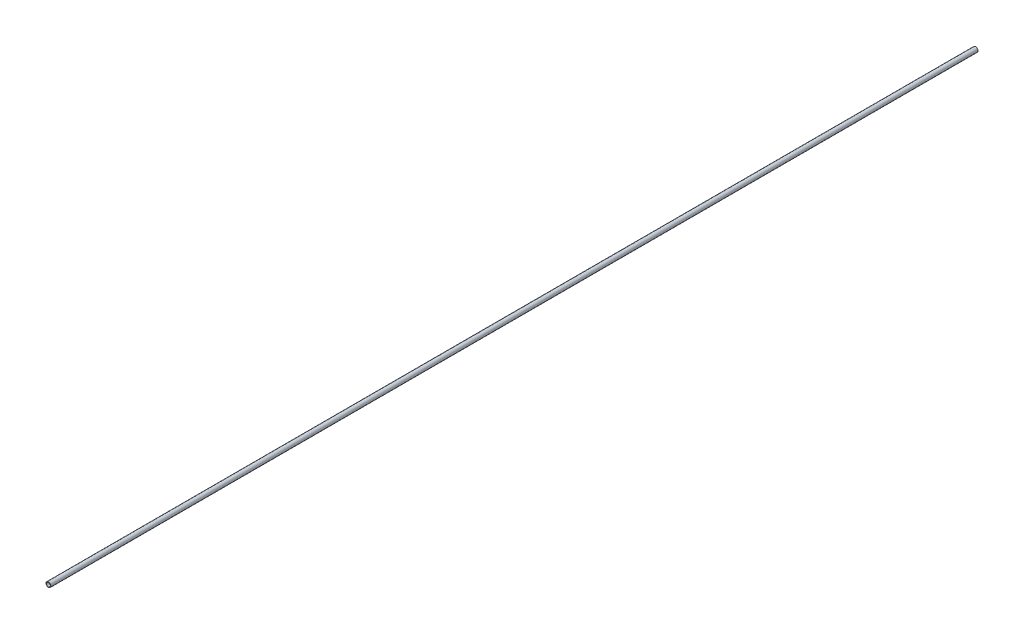
ISO-10303-21;
HEADER;
FILE_DESCRIPTION(('STEP AP214'),'2;1');
FILE_NAME('part.step','',(''),(''),'','','');
FILE_SCHEMA(('AUTOMOTIVE_DESIGN { 1 0 10303 214 1 1 1 1 }'));
ENDSEC;
DATA;
#1=APPLICATION_CONTEXT('core data for automotive mechanical design processes');
#2=APPLICATION_PROTOCOL_DEFINITION('international standard','automotive_design',2000,#1);
#3=PRODUCT_CONTEXT('',#1,'mechanical');
#4=PRODUCT('Part','Part','',(#3));
#5=PRODUCT_RELATED_PRODUCT_CATEGORY('part','',(#4));
#6=PRODUCT_DEFINITION_FORMATION('','',#4);
#7=PRODUCT_DEFINITION_CONTEXT('part definition',#1,'design');
#8=PRODUCT_DEFINITION('design','',#6,#7);
#9=PRODUCT_DEFINITION_SHAPE('','',#8);
#10=(LENGTH_UNIT() NAMED_UNIT(*) SI_UNIT(.MILLI.,.METRE.));
#11=(NAMED_UNIT(*) PLANE_ANGLE_UNIT() SI_UNIT($,.RADIAN.));
#12=(NAMED_UNIT(*) SI_UNIT($,.STERADIAN.) SOLID_ANGLE_UNIT());
#13=UNCERTAINTY_MEASURE_WITH_UNIT(LENGTH_MEASURE(1.E-05),#10,'distance_accuracy_value','');
#14=(GEOMETRIC_REPRESENTATION_CONTEXT(3) GLOBAL_UNCERTAINTY_ASSIGNED_CONTEXT((#13)) GLOBAL_UNIT_ASSIGNED_CONTEXT((#10,
#11,#12)) REPRESENTATION_CONTEXT('',''));
#15=CARTESIAN_POINT('',(0.,0.,0.));
#16=DIRECTION('',(0.,0.,1.));
#17=DIRECTION('',(1.,0.,0.));
#18=AXIS2_PLACEMENT_3D('',#15,#16,#17);
#19=CARTESIAN_POINT('',(0.,0.,-6426.2));
#20=DIRECTION('',(0.,0.,1.));
#21=DIRECTION('',(1.,0.,0.));
#22=AXIS2_PLACEMENT_3D('',#19,#20,#21);
#23=CYLINDRICAL_SURFACE('',#22,16.7005);
#24=CARTESIAN_POINT('',(0.,0.,-6426.2));
#25=DIRECTION('',(0.,0.,1.));
#26=DIRECTION('',(1.,0.,0.));
#27=AXIS2_PLACEMENT_3D('',#24,#25,#26);
#28=CIRCLE('',#27,16.7005);
#29=CARTESIAN_POINT('',(16.7005,0.,-6426.2));
#30=VERTEX_POINT('',#29);
#31=EDGE_CURVE('E10',#30,#30,#28,.T.);
#32=ORIENTED_EDGE('',*,*,#31,.T.);
#33=EDGE_LOOP('',(#32));
#34=FACE_BOUND('',#33,.T.);
#35=CARTESIAN_POINT('',(0.,0.,0.));
#36=DIRECTION('',(0.,0.,1.));
#37=DIRECTION('',(1.,0.,0.));
#38=AXIS2_PLACEMENT_3D('',#35,#36,#37);
#39=CIRCLE('',#38,16.7005);
#40=CARTESIAN_POINT('',(16.7005,0.,0.));
#41=VERTEX_POINT('',#40);
#42=EDGE_CURVE('E36',#41,#41,#39,.T.);
#43=ORIENTED_EDGE('',*,*,#42,.F.);
#44=EDGE_LOOP('',(#43));
#45=FACE_BOUND('',#44,.T.);
#46=ADVANCED_FACE('F33',(#34,#45),#23,.T.);
#47=CARTESIAN_POINT('',(0.,0.,-6426.2));
#48=DIRECTION('',(0.,0.,1.));
#49=DIRECTION('',(1.,0.,0.));
#50=AXIS2_PLACEMENT_3D('',#47,#48,#49);
#51=PLANE('',#50);
#52=CARTESIAN_POINT('',(0.,0.,-6426.2));
#53=DIRECTION('',(0.,0.,1.));
#54=DIRECTION('',(1.,0.,0.));
#55=AXIS2_PLACEMENT_3D('',#52,#53,#54);
#56=CIRCLE('',#55,13.3223);
#57=CARTESIAN_POINT('',(13.3223,0.,-6426.2));
#58=VERTEX_POINT('',#57);
#59=EDGE_CURVE('E43',#58,#58,#56,.T.);
#60=ORIENTED_EDGE('',*,*,#59,.T.);
#61=EDGE_LOOP('',(#60));
#62=FACE_BOUND('',#61,.T.);
#63=ORIENTED_EDGE('',*,*,#31,.F.);
#64=EDGE_LOOP('',(#63));
#65=FACE_BOUND('',#64,.T.);
#66=ADVANCED_FACE('F51',(#62,#65),#51,.F.);
#67=CARTESIAN_POINT('',(0.,0.,0.));
#68=DIRECTION('',(0.,0.,1.));
#69=DIRECTION('',(1.,0.,0.));
#70=AXIS2_PLACEMENT_3D('',#67,#68,#69);
#71=PLANE('',#70);
#72=CARTESIAN_POINT('',(0.,0.,0.));
#73=DIRECTION('',(0.,0.,1.));
#74=DIRECTION('',(1.,0.,0.));
#75=AXIS2_PLACEMENT_3D('',#72,#73,#74);
#76=CIRCLE('',#75,13.3223);
#77=CARTESIAN_POINT('',(13.3223,0.,0.));
#78=VERTEX_POINT('',#77);
#79=EDGE_CURVE('E45',#78,#78,#76,.T.);
#80=ORIENTED_EDGE('',*,*,#79,.F.);
#81=EDGE_LOOP('',(#80));
#82=FACE_BOUND('',#81,.T.);
#83=ORIENTED_EDGE('',*,*,#42,.T.);
#84=EDGE_LOOP('',(#83));
#85=FACE_BOUND('',#84,.T.);
#86=ADVANCED_FACE('F57',(#82,#85),#71,.T.);
#87=CARTESIAN_POINT('',(0.,0.,-6426.2));
#88=DIRECTION('',(0.,0.,1.));
#89=DIRECTION('',(1.,0.,0.));
#90=AXIS2_PLACEMENT_3D('',#87,#88,#89);
#91=CYLINDRICAL_SURFACE('',#90,13.3223);
#92=ORIENTED_EDGE('',*,*,#59,.F.);
#93=EDGE_LOOP('',(#92));
#94=FACE_BOUND('',#93,.T.);
#95=ORIENTED_EDGE('',*,*,#79,.T.);
#96=EDGE_LOOP('',(#95));
#97=FACE_BOUND('',#96,.T.);
#98=ADVANCED_FACE('F54',(#94,#97),#91,.F.);
#99=CLOSED_SHELL('',(#46,#66,#86,#98));
#100=MANIFOLD_SOLID_BREP('B2',#99);
#101=ADVANCED_BREP_SHAPE_REPRESENTATION('',(#18,#100),#14);
#102=SHAPE_DEFINITION_REPRESENTATION(#9,#101);
ENDSEC;
END-ISO-10303-21;
